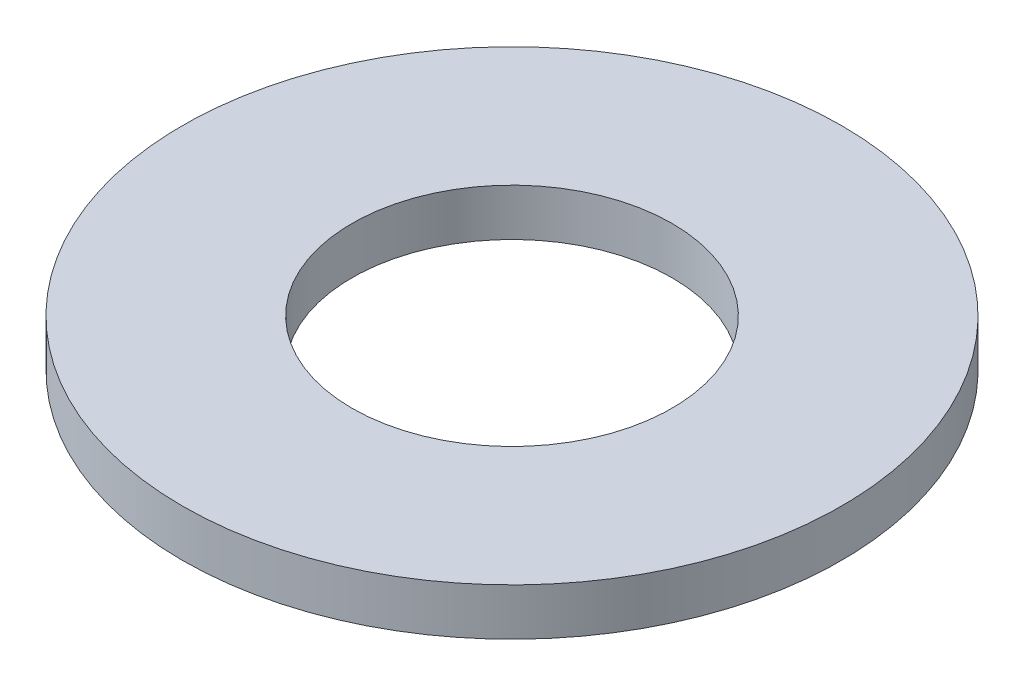
ISO-10303-21;
HEADER;
FILE_DESCRIPTION(('STEP AP214'),'2;1');
FILE_NAME('part.step','',(''),(''),'','','');
FILE_SCHEMA(('AUTOMOTIVE_DESIGN { 1 0 10303 214 1 1 1 1 }'));
ENDSEC;
DATA;
#1=APPLICATION_CONTEXT('core data for automotive mechanical design processes');
#2=APPLICATION_PROTOCOL_DEFINITION('international standard','automotive_design',2000,#1);
#3=PRODUCT_CONTEXT('',#1,'mechanical');
#4=PRODUCT('Part','Part','',(#3));
#5=PRODUCT_RELATED_PRODUCT_CATEGORY('part','',(#4));
#6=PRODUCT_DEFINITION_FORMATION('','',#4);
#7=PRODUCT_DEFINITION_CONTEXT('part definition',#1,'design');
#8=PRODUCT_DEFINITION('design','',#6,#7);
#9=PRODUCT_DEFINITION_SHAPE('','',#8);
#10=(LENGTH_UNIT() NAMED_UNIT(*) SI_UNIT(.MILLI.,.METRE.));
#11=(NAMED_UNIT(*) PLANE_ANGLE_UNIT() SI_UNIT($,.RADIAN.));
#12=(NAMED_UNIT(*) SI_UNIT($,.STERADIAN.) SOLID_ANGLE_UNIT());
#13=UNCERTAINTY_MEASURE_WITH_UNIT(LENGTH_MEASURE(1.E-05),#10,'distance_accuracy_value','');
#14=(GEOMETRIC_REPRESENTATION_CONTEXT(3) GLOBAL_UNCERTAINTY_ASSIGNED_CONTEXT((#13)) GLOBAL_UNIT_ASSIGNED_CONTEXT((#10,
#11,#12)) REPRESENTATION_CONTEXT('',''));
#15=CARTESIAN_POINT('',(0.,0.,0.));
#16=DIRECTION('',(0.,0.,1.));
#17=DIRECTION('',(1.,0.,0.));
#18=AXIS2_PLACEMENT_3D('',#15,#16,#17);
#19=CARTESIAN_POINT('',(-56.2916512459885,-157.,50.));
#20=DIRECTION('',(0.,1.,0.));
#21=DIRECTION('',(0.,0.,1.));
#22=AXIS2_PLACEMENT_3D('',#19,#20,#21);
#23=PLANE('',#22);
#24=CARTESIAN_POINT('',(-56.2916512459885,-157.,50.));
#25=DIRECTION('',(0.,1.,0.));
#26=DIRECTION('',(0.,0.,1.));
#27=AXIS2_PLACEMENT_3D('',#24,#25,#26);
#28=CIRCLE('',#27,3.5);
#29=CARTESIAN_POINT('',(-56.2916512459885,-157.,53.5));
#30=VERTEX_POINT('',#29);
#31=EDGE_CURVE('E10',#30,#30,#28,.T.);
#32=ORIENTED_EDGE('',*,*,#31,.T.);
#33=EDGE_LOOP('',(#32));
#34=FACE_BOUND('',#33,.T.);
#35=CARTESIAN_POINT('',(-56.2916512459885,-157.,50.));
#36=DIRECTION('',(0.,1.,0.));
#37=DIRECTION('',(0.,0.,1.));
#38=AXIS2_PLACEMENT_3D('',#35,#36,#37);
#39=CIRCLE('',#38,1.7);
#40=CARTESIAN_POINT('',(-56.2916512459885,-157.,51.7));
#41=VERTEX_POINT('',#40);
#42=EDGE_CURVE('E49',#41,#41,#39,.T.);
#43=ORIENTED_EDGE('',*,*,#42,.F.);
#44=EDGE_LOOP('',(#43));
#45=FACE_BOUND('',#44,.T.);
#46=ADVANCED_FACE('F39',(#34,#45),#23,.T.);
#47=CARTESIAN_POINT('',(-56.2916512459885,-157.5,50.));
#48=DIRECTION('',(0.,1.,0.));
#49=DIRECTION('',(0.,0.,1.));
#50=AXIS2_PLACEMENT_3D('',#47,#48,#49);
#51=PLANE('',#50);
#52=CARTESIAN_POINT('',(-56.2916512459885,-157.5,50.));
#53=DIRECTION('',(0.,1.,0.));
#54=DIRECTION('',(0.,0.,1.));
#55=AXIS2_PLACEMENT_3D('',#52,#53,#54);
#56=CIRCLE('',#55,3.5);
#57=CARTESIAN_POINT('',(-56.2916512459885,-157.5,53.5));
#58=VERTEX_POINT('',#57);
#59=EDGE_CURVE('E43',#58,#58,#56,.T.);
#60=ORIENTED_EDGE('',*,*,#59,.F.);
#61=EDGE_LOOP('',(#60));
#62=FACE_BOUND('',#61,.T.);
#63=CARTESIAN_POINT('',(-56.2916512459885,-157.5,50.));
#64=DIRECTION('',(0.,1.,0.));
#65=DIRECTION('',(0.,0.,1.));
#66=AXIS2_PLACEMENT_3D('',#63,#64,#65);
#67=CIRCLE('',#66,1.7);
#68=CARTESIAN_POINT('',(-56.2916512459885,-157.5,51.7));
#69=VERTEX_POINT('',#68);
#70=EDGE_CURVE('E55',#69,#69,#67,.T.);
#71=ORIENTED_EDGE('',*,*,#70,.T.);
#72=EDGE_LOOP('',(#71));
#73=FACE_BOUND('',#72,.T.);
#74=ADVANCED_FACE('F61',(#62,#73),#51,.F.);
#75=CARTESIAN_POINT('',(-56.2916512459885,-157.,50.));
#76=DIRECTION('',(0.,-1.,0.));
#77=DIRECTION('',(0.,0.,-1.));
#78=AXIS2_PLACEMENT_3D('',#75,#76,#77);
#79=CYLINDRICAL_SURFACE('',#78,3.5);
#80=ORIENTED_EDGE('',*,*,#31,.F.);
#81=EDGE_LOOP('',(#80));
#82=FACE_BOUND('',#81,.T.);
#83=ORIENTED_EDGE('',*,*,#59,.T.);
#84=EDGE_LOOP('',(#83));
#85=FACE_BOUND('',#84,.T.);
#86=ADVANCED_FACE('F41',(#82,#85),#79,.T.);
#87=CARTESIAN_POINT('',(-56.2916512459885,-157.,50.));
#88=DIRECTION('',(0.,-1.,0.));
#89=DIRECTION('',(0.,0.,-1.));
#90=AXIS2_PLACEMENT_3D('',#87,#88,#89);
#91=CYLINDRICAL_SURFACE('',#90,1.7);
#92=ORIENTED_EDGE('',*,*,#42,.T.);
#93=EDGE_LOOP('',(#92));
#94=FACE_BOUND('',#93,.T.);
#95=ORIENTED_EDGE('',*,*,#70,.F.);
#96=EDGE_LOOP('',(#95));
#97=FACE_BOUND('',#96,.T.);
#98=ADVANCED_FACE('F59',(#94,#97),#91,.F.);
#99=CLOSED_SHELL('',(#46,#74,#86,#98));
#100=MANIFOLD_SOLID_BREP('B2',#99);
#101=ADVANCED_BREP_SHAPE_REPRESENTATION('',(#18,#100),#14);
#102=SHAPE_DEFINITION_REPRESENTATION(#9,#101);
ENDSEC;
END-ISO-10303-21;
